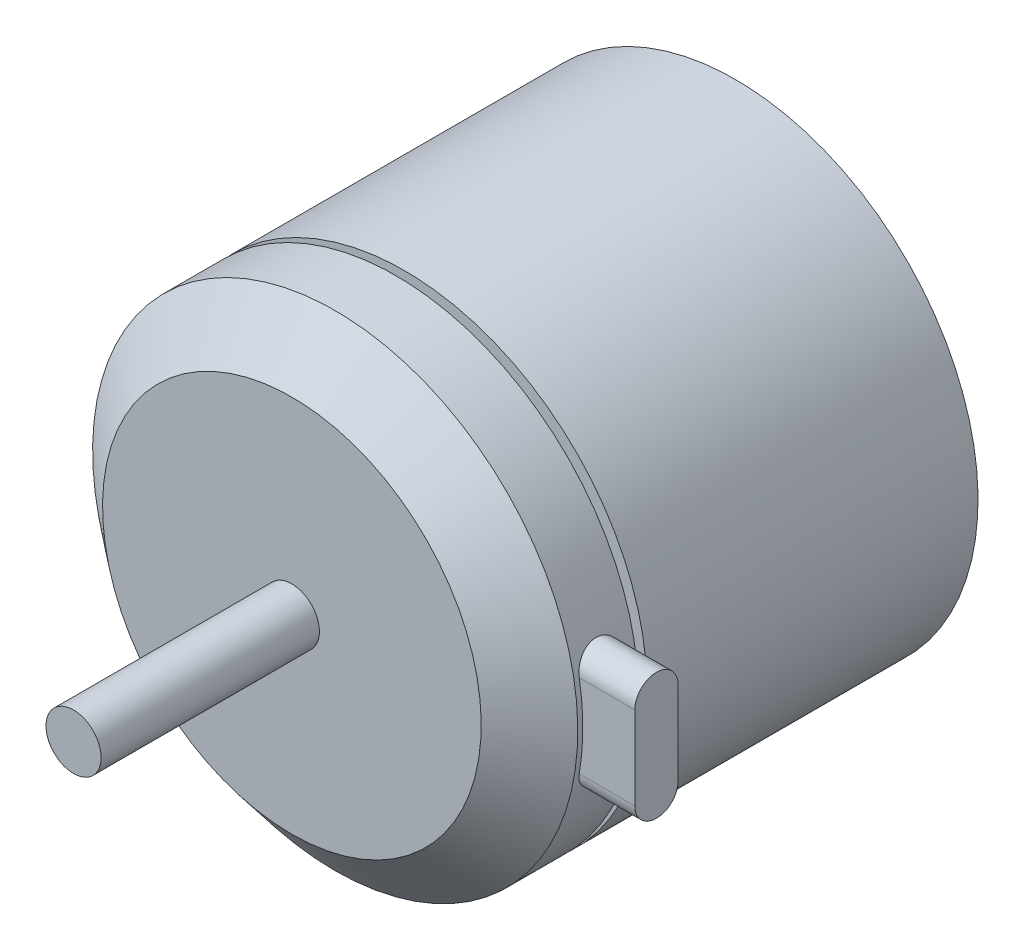
ISO-10303-21;
HEADER;
FILE_DESCRIPTION(('STEP AP214'),'2;1');
FILE_NAME('part.step','',(''),(''),'','','');
FILE_SCHEMA(('AUTOMOTIVE_DESIGN { 1 0 10303 214 1 1 1 1 }'));
ENDSEC;
DATA;
#1=APPLICATION_CONTEXT('core data for automotive mechanical design processes');
#2=APPLICATION_PROTOCOL_DEFINITION('international standard','automotive_design',2000,#1);
#3=PRODUCT_CONTEXT('',#1,'mechanical');
#4=PRODUCT('Part','Part','',(#3));
#5=PRODUCT_RELATED_PRODUCT_CATEGORY('part','',(#4));
#6=PRODUCT_DEFINITION_FORMATION('','',#4);
#7=PRODUCT_DEFINITION_CONTEXT('part definition',#1,'design');
#8=PRODUCT_DEFINITION('design','',#6,#7);
#9=PRODUCT_DEFINITION_SHAPE('','',#8);
#10=(LENGTH_UNIT() NAMED_UNIT(*) SI_UNIT(.MILLI.,.METRE.));
#11=(NAMED_UNIT(*) PLANE_ANGLE_UNIT() SI_UNIT($,.RADIAN.));
#12=(NAMED_UNIT(*) SI_UNIT($,.STERADIAN.) SOLID_ANGLE_UNIT());
#13=UNCERTAINTY_MEASURE_WITH_UNIT(LENGTH_MEASURE(1.E-05),#10,'distance_accuracy_value','');
#14=(GEOMETRIC_REPRESENTATION_CONTEXT(3) GLOBAL_UNCERTAINTY_ASSIGNED_CONTEXT((#13)) GLOBAL_UNIT_ASSIGNED_CONTEXT((#10,
#11,#12)) REPRESENTATION_CONTEXT('',''));
#15=CARTESIAN_POINT('',(0.,0.,0.));
#16=DIRECTION('',(0.,0.,1.));
#17=DIRECTION('',(1.,0.,0.));
#18=AXIS2_PLACEMENT_3D('',#15,#16,#17);
#19=CARTESIAN_POINT('',(0.,0.,22.55));
#20=DIRECTION('',(0.,0.,1.));
#21=DIRECTION('',(0.,-1.,0.));
#22=AXIS2_PLACEMENT_3D('',#19,#20,#21);
#23=CYLINDRICAL_SURFACE('',#22,14.);
#24=CARTESIAN_POINT('',(0.,0.,3.95));
#25=DIRECTION('',(0.,0.,1.));
#26=DIRECTION('',(0.,-1.,0.));
#27=AXIS2_PLACEMENT_3D('',#24,#25,#26);
#28=CIRCLE('',#27,14.);
#29=CARTESIAN_POINT('',(0.,-14.,3.94999999999999));
#30=VERTEX_POINT('',#29);
#31=EDGE_CURVE('E135',#30,#30,#28,.T.);
#32=ORIENTED_EDGE('',*,*,#31,.T.);
#33=EDGE_LOOP('',(#32));
#34=FACE_BOUND('',#33,.T.);
#35=CARTESIAN_POINT('',(0.,0.,7.45));
#36=DIRECTION('',(0.,0.,1.));
#37=DIRECTION('',(0.,-1.,0.));
#38=AXIS2_PLACEMENT_3D('',#35,#36,#37);
#39=CIRCLE('',#38,14.);
#40=CARTESIAN_POINT('',(0.,-14.,7.45));
#41=VERTEX_POINT('',#40);
#42=EDGE_CURVE('E138',#41,#41,#39,.T.);
#43=ORIENTED_EDGE('',*,*,#42,.F.);
#44=EDGE_LOOP('',(#43));
#45=FACE_BOUND('',#44,.T.);
#46=CARTESIAN_POINT('',(13.7927517196533,2.4,7.158936123469));
#47=CARTESIAN_POINT('',(13.8049579997668,2.32984665616621,7.15893331763109));
#48=CARTESIAN_POINT('',(13.8166324259604,2.25955630932709,7.15301248094008));
#49=CARTESIAN_POINT('',(13.8386240661835,2.12071632788645,7.12937370438224));
#50=CARTESIAN_POINT('',(13.8489399877856,2.05216840026345,7.11164462635648));
#51=CARTESIAN_POINT('',(13.8680421528803,1.91883915631029,7.06478046674951));
#52=CARTESIAN_POINT('',(13.8768281437007,1.85405846332323,7.03564350370241));
#53=CARTESIAN_POINT('',(13.8928114699814,1.73022887511694,6.96672930965807));
#54=CARTESIAN_POINT('',(13.9000091633989,1.67117869008724,6.92695448061423));
#55=CARTESIAN_POINT('',(13.9127992546305,1.56110967340118,6.83829566585727));
#56=CARTESIAN_POINT('',(13.9184063576336,1.51001938175588,6.78950250905021));
#57=CARTESIAN_POINT('',(13.9282128039744,1.41671963549054,6.68393407988574));
#58=CARTESIAN_POINT('',(13.9324121511597,1.37451015659821,6.62715882934503));
#59=CARTESIAN_POINT('',(13.9395178213522,1.30047014127505,6.50763842146956));
#60=CARTESIAN_POINT('',(13.9424322792844,1.26857465783872,6.44493396772794));
#61=CARTESIAN_POINT('',(13.947140052529,1.215727086,6.31503253479995));
#62=CARTESIAN_POINT('',(13.9489333815572,1.19477486371816,6.24783561058566));
#63=CARTESIAN_POINT('',(13.9514979514972,1.16444776726383,6.11096717327018));
#64=CARTESIAN_POINT('',(13.9522707417003,1.15505534550689,6.04129957642904));
#65=CARTESIAN_POINT('',(13.9528480124118,1.14806152655059,5.90137108955421));
#66=CARTESIAN_POINT('',(13.9526524952626,1.15046010082889,5.8311102009561));
#67=CARTESIAN_POINT('',(13.9512805529755,1.16697823484622,5.69199504842004));
#68=CARTESIAN_POINT('',(13.9501042002132,1.18109692976038,5.62314068107931));
#69=CARTESIAN_POINT('',(13.9466991601195,1.22064458044202,5.48878807228836));
#70=CARTESIAN_POINT('',(13.9444704760221,1.24607350144998,5.42328982052453));
#71=CARTESIAN_POINT('',(13.9388445618794,1.30750095354246,5.2975080120101));
#72=CARTESIAN_POINT('',(13.9354473387405,1.34349942215642,5.23722442444132));
#73=CARTESIAN_POINT('',(13.9273476195134,1.42501229353423,5.12357701065721));
#74=CARTESIAN_POINT('',(13.9226451345384,1.47052661527763,5.070213125532));
#75=CARTESIAN_POINT('',(13.9118048946484,1.56976803586401,4.97186716083128));
#76=CARTESIAN_POINT('',(13.9056662009507,1.62350049853327,4.92689059836281));
#77=CARTESIAN_POINT('',(13.8918723349883,1.73757839757932,4.8465976198772));
#78=CARTESIAN_POINT('',(13.8842171529659,1.79792387650583,4.81128126602125));
#79=CARTESIAN_POINT('',(13.8673469751399,1.92372743323077,4.75111671095438));
#80=CARTESIAN_POINT('',(13.8581257663015,1.98920529314878,4.72631163837194));
#81=CARTESIAN_POINT('',(13.8382342348309,2.12317147559064,4.68798529417694));
#82=CARTESIAN_POINT('',(13.827563839038,2.19165994998431,4.6744645924913));
#83=CARTESIAN_POINT('',(13.8048509667578,2.33046925278694,4.65889796872708));
#84=CARTESIAN_POINT('',(13.7927949606406,2.40080186834395,4.65697709544549));
#85=CARTESIAN_POINT('',(13.7677250583069,2.54062872265417,4.6648988798193));
#86=CARTESIAN_POINT('',(13.754711071031,2.61012288097656,4.67474265710297));
#87=CARTESIAN_POINT('',(13.727945230602,2.74745155052186,4.70610026900479));
#88=CARTESIAN_POINT('',(13.714185085079,2.81524384522036,4.72779201610896));
#89=CARTESIAN_POINT('',(13.6866542717042,2.94617981088443,4.78234009085539));
#90=CARTESIAN_POINT('',(13.6728836030469,3.00932308018145,4.81519738180933));
#91=CARTESIAN_POINT('',(13.6458219148097,3.1297590338086,4.89154732684884));
#92=CARTESIAN_POINT('',(13.632536261689,3.18699458084946,4.93513212742348));
#93=CARTESIAN_POINT('',(13.6072452493954,3.29330658730026,5.03163558860133));
#94=CARTESIAN_POINT('',(13.5952398491969,3.34238330818767,5.08455394996662));
#95=CARTESIAN_POINT('',(13.5733010570957,3.43038459965917,5.1976792090709));
#96=CARTESIAN_POINT('',(13.5633464562243,3.46941425094324,5.25780013922571));
#97=CARTESIAN_POINT('',(13.545947234434,3.53673987236768,5.38411123029044));
#98=CARTESIAN_POINT('',(13.5385021267771,3.56503792412844,5.45030021107763));
#99=CARTESIAN_POINT('',(13.5267808972628,3.609253335922,5.5847914728706));
#100=CARTESIAN_POINT('',(13.5224182309546,3.62550948903847,5.65297482576328));
#101=CARTESIAN_POINT('',(13.5167986004113,3.64640588195747,5.79122055623561));
#102=CARTESIAN_POINT('',(13.5155410881962,3.65104817131104,5.86128260006813));
#103=CARTESIAN_POINT('',(13.5162057809975,3.64858615532328,5.99938401400765));
#104=CARTESIAN_POINT('',(13.5180475063612,3.64177916214475,6.06742929733792));
#105=CARTESIAN_POINT('',(13.5246400887842,3.61721854017901,6.20136456138442));
#106=CARTESIAN_POINT('',(13.5293909015197,3.59946507817551,6.26725457492289));
#107=CARTESIAN_POINT('',(13.5415117042244,3.55359245740492,6.39508213864496));
#108=CARTESIAN_POINT('',(13.5488826033451,3.52546970043934,6.45701830806182));
#109=CARTESIAN_POINT('',(13.5658161973798,3.45973673542355,6.57529736403061));
#110=CARTESIAN_POINT('',(13.5753790739826,3.42212574088566,6.63163978637253));
#111=CARTESIAN_POINT('',(13.5964477728098,3.33744722866814,6.7386746199472));
#112=CARTESIAN_POINT('',(13.6079964872183,3.29016527678918,6.78918885514883));
#113=CARTESIAN_POINT('',(13.6322713934435,3.18809110795582,6.88164197425808));
#114=CARTESIAN_POINT('',(13.6449980316831,3.13329603977618,6.92357758745295));
#115=CARTESIAN_POINT('',(13.671421455375,3.01595019894538,6.99894161312979));
#116=CARTESIAN_POINT('',(13.6851358260878,2.95321745956015,7.03208047706131));
#117=CARTESIAN_POINT('',(13.7125666408842,2.82310486198821,7.08726841270419));
#118=CARTESIAN_POINT('',(13.726283069543,2.75572965458562,7.10932840461017));
#119=CARTESIAN_POINT('',(13.7489070327131,2.64004775596412,7.13661900694201));
#120=CARTESIAN_POINT('',(13.7579581775469,2.5924817640583,7.1449695305436));
#121=CARTESIAN_POINT('',(13.7756743285492,2.4966322078754,7.15612906758287));
#122=CARTESIAN_POINT('',(13.7843393330586,2.44834864051608,7.15893805721073));
#123=CARTESIAN_POINT('',(13.7927517196533,2.4,7.158936123469));
#124=B_SPLINE_CURVE_WITH_KNOTS('',3,(#46,#47,#48,#49,#50,#51,#52,#53,#54,#55,#56,#57,#58,#59,
#60,#61,#62,#63,#64,#65,#66,#67,#68,#69,#70,#71,#72,#73,#74,#75,#76,#77,#78,#79,#80,#81,#82,#83,
#84,#85,#86,#87,#88,#89,#90,#91,#92,#93,#94,#95,#96,#97,#98,#99,#100,#101,#102,#103,#104,#105,
#106,#107,#108,#109,#110,#111,#112,#113,#114,#115,#116,#117,#118,#119,#120,#121,#122,#123),
.UNSPECIFIED.,.T.,.F.,(4,2,2,2,2,2,2,2,2,2,2,2,2,2,2,2,2,2,2,2,2,2,2,2,2,2,2,2,2,2,2,2,2,2,2,2,
2,2,4),(0.,0.213447038063583,0.427095696356338,0.640779605889871,0.854415307811519,
1.06600626709658,1.27759664807154,1.48782745901992,1.69805569795167,1.90796441874818,
2.11787263177708,2.32776535710653,2.53765743738091,2.74754827712808,2.95743732988306,
3.1674639625304,3.3774919466184,3.58837353848394,3.79926578046223,4.01242748777733,
4.22560948306245,4.44208438681954,4.6585779717774,4.87700038277209,5.09541579232411,
5.31144438710935,5.52743105712692,5.73708262127014,5.94669718464325,6.15095214074658,
6.35520398483652,6.55952677216893,6.76386650155061,6.97335597864233,7.18292517810857,
7.39871655726878,7.61429481620556,7.76139870617576,7.90850322819268),.UNSPECIFIED.);
#125=CARTESIAN_POINT('',(13.7927517196533,2.4,4.65893612346899));
#126=VERTEX_POINT('',#125);
#127=CARTESIAN_POINT('',(13.7927517196533,2.4,7.158936123469));
#128=VERTEX_POINT('',#127);
#129=EDGE_CURVE('E11',#126,#128,#124,.T.);
#130=ORIENTED_EDGE('',*,*,#129,.F.);
#131=CARTESIAN_POINT('',(0.,0.,4.65893612346899));
#132=DIRECTION('',(0.,0.,1.));
#133=DIRECTION('',(1.,0.,0.));
#134=AXIS2_PLACEMENT_3D('',#131,#132,#133);
#135=CIRCLE('',#134,14.);
#136=CARTESIAN_POINT('',(13.7927517196533,-2.4,4.65893612346899));
#137=VERTEX_POINT('',#136);
#138=EDGE_CURVE('E150',#137,#126,#135,.T.);
#139=ORIENTED_EDGE('',*,*,#138,.F.);
#140=CARTESIAN_POINT('',(13.7927517196533,-2.4,7.158936123469));
#141=CARTESIAN_POINT('',(13.780302245697,-2.47154209616521,7.15893301567698));
#142=CARTESIAN_POINT('',(13.7672826808585,-2.54303865255947,7.1527744818256));
#143=CARTESIAN_POINT('',(13.7405245667623,-2.6838667866475,7.12837845788841));
#144=CARTESIAN_POINT('',(13.726785097875,-2.75319540517082,7.11012515312788));
#145=CARTESIAN_POINT('',(13.6991304142212,-2.88765190047125,7.06209961931391));
#146=CARTESIAN_POINT('',(13.6852153331505,-2.95278276660084,7.03233569548358));
#147=CARTESIAN_POINT('',(13.6578067896785,-3.07707139314781,6.96210696053179));
#148=CARTESIAN_POINT('',(13.6443132253609,-3.13623060526087,6.92164475883623));
#149=CARTESIAN_POINT('',(13.6183736541685,-3.24702124145471,6.83099197119919));
#150=CARTESIAN_POINT('',(13.6059296340319,-3.29863851847746,6.78078350375276));
#151=CARTESIAN_POINT('',(13.5827910679217,-3.39265930749941,6.67201765099814));
#152=CARTESIAN_POINT('',(13.5720964340006,-3.435063282716,6.61346068567283));
#153=CARTESIAN_POINT('',(13.5532742655377,-3.50858595265678,6.49079011954205));
#154=CARTESIAN_POINT('',(13.5451022811969,-3.53990168123884,6.42680156607071));
#155=CARTESIAN_POINT('',(13.5315717904969,-3.59127783017089,6.2941775886012));
#156=CARTESIAN_POINT('',(13.5262126747884,-3.61134068828531,6.22554317467189));
#157=CARTESIAN_POINT('',(13.5187825785333,-3.63905460169251,6.08787705157679));
#158=CARTESIAN_POINT('',(13.5166142781018,-3.64707317441428,6.01892446530962));
#159=CARTESIAN_POINT('',(13.5153941688966,-3.65159241173047,5.88061961885425));
#160=CARTESIAN_POINT('',(13.5163419560026,-3.64809456987015,5.81126741165669));
#161=CARTESIAN_POINT('',(13.5212456663304,-3.62987600656706,5.67545028560377));
#162=CARTESIAN_POINT('',(13.5251468840969,-3.61535937002564,5.60895583380432));
#163=CARTESIAN_POINT('',(13.5356507868651,-3.57583172878925,5.47939250742093));
#164=CARTESIAN_POINT('',(13.5422535781888,-3.55082031106575,5.41632376776834));
#165=CARTESIAN_POINT('',(13.5578556410704,-3.49077612084009,5.29464019254107));
#166=CARTESIAN_POINT('',(13.5668795117533,-3.45564019167374,5.23607949653165));
#167=CARTESIAN_POINT('',(13.5867893018054,-3.3765095406749,5.12564458972975));
#168=CARTESIAN_POINT('',(13.5976754918659,-3.33251353084899,5.07377135289615));
#169=CARTESIAN_POINT('',(13.6210973394499,-3.23546997486559,4.97654939980571));
#170=CARTESIAN_POINT('',(13.6336722246003,-3.18219342638062,4.93143869997719));
#171=CARTESIAN_POINT('',(13.6595939017979,-3.06901638881599,4.8507542812717));
#172=CARTESIAN_POINT('',(13.6729408067351,-3.00911492982298,4.8151819614692));
#173=CARTESIAN_POINT('',(13.7001561363566,-2.8827070303358,4.7537065645167));
#174=CARTESIAN_POINT('',(13.7140292467464,-2.81607264645384,4.72806826811898));
#175=CARTESIAN_POINT('',(13.7413967192547,-2.67934226286505,4.68847141044191));
#176=CARTESIAN_POINT('',(13.7548910651722,-2.60924611543985,4.67451334803159));
#177=CARTESIAN_POINT('',(13.7810804450312,-2.46719684051281,4.65869002741169));
#178=CARTESIAN_POINT('',(13.7937713324896,-2.39523641595485,4.65688312145948));
#179=CARTESIAN_POINT('',(13.8179013748371,-2.25186271183907,4.66566924148799));
#180=CARTESIAN_POINT('',(13.8293406088351,-2.18044939796754,4.676261483303));
#181=CARTESIAN_POINT('',(13.8505819682313,-2.04114825949574,4.70944064309263));
#182=CARTESIAN_POINT('',(13.8604023047933,-1.97322813058399,4.73188018111875));
#183=CARTESIAN_POINT('',(13.8784477823725,-1.84203016248182,4.78810526033142));
#184=CARTESIAN_POINT('',(13.8866730555817,-1.77875193886112,4.82188986065452));
#185=CARTESIAN_POINT('',(13.9014048744831,-1.65966711081869,4.89929489432244));
#186=CARTESIAN_POINT('',(13.9079352593929,-1.60376301441595,4.94276085907035));
#187=CARTESIAN_POINT('',(13.9195081674379,-1.50000764888545,5.03859129884301));
#188=CARTESIAN_POINT('',(13.9245507617662,-1.45215599448225,5.09095534789083));
#189=CARTESIAN_POINT('',(13.9332351684537,-1.3663122236943,5.20260323207841));
#190=CARTESIAN_POINT('',(13.9368886116593,-1.32823914961486,5.26182393960824));
#191=CARTESIAN_POINT('',(13.9429941256065,-1.26254037831848,5.38585819208774));
#192=CARTESIAN_POINT('',(13.9454462164976,-1.23491450587946,5.45067164321267));
#193=CARTESIAN_POINT('',(13.9492675012683,-1.19097637974834,5.58387056833819));
#194=CARTESIAN_POINT('',(13.9506394605739,-1.17463524738122,5.65224643934765));
#195=CARTESIAN_POINT('',(13.9523926086753,-1.15362619623794,5.79078116123604));
#196=CARTESIAN_POINT('',(13.95277379814,-1.1489582695817,5.86094001091133));
#197=CARTESIAN_POINT('',(13.9525699680932,-1.15143067328628,6.0010294397966));
#198=CARTESIAN_POINT('',(13.9519852013667,-1.15856791430529,6.07096007393092));
#199=CARTESIAN_POINT('',(13.9498126477348,-1.18443801701204,6.2086265289224));
#200=CARTESIAN_POINT('',(13.9482248610549,-1.20317087609317,6.27636235027292));
#201=CARTESIAN_POINT('',(13.9439544304957,-1.25168846160427,6.40771730486194));
#202=CARTESIAN_POINT('',(13.9412717706705,-1.28147334899638,6.47133637812811));
#203=CARTESIAN_POINT('',(13.9346838570077,-1.35122447886092,6.59265034775883));
#204=CARTESIAN_POINT('',(13.9307786579457,-1.39119026516557,6.6503455093891));
#205=CARTESIAN_POINT('',(13.9216083695625,-1.48013989139226,6.75819723617975));
#206=CARTESIAN_POINT('',(13.9163430416874,-1.52912531284093,6.80835247646457));
#207=CARTESIAN_POINT('',(13.9043382137524,-1.63468480804595,6.89972681719321));
#208=CARTESIAN_POINT('',(13.8975983732209,-1.69126063329257,6.94094384937962));
#209=CARTESIAN_POINT('',(13.8825669438221,-1.81051248569673,7.0134224941345));
#210=CARTESIAN_POINT('',(13.8742706249132,-1.87320682035189,7.04465295434698));
#211=CARTESIAN_POINT('',(13.8561724685423,-2.00268351311028,7.09615307113996));
#212=CARTESIAN_POINT('',(13.8463722778256,-2.06946135222358,7.11643460838672));
#213=CARTESIAN_POINT('',(13.8292165764134,-2.1805257016275,7.14031338271769));
#214=CARTESIAN_POINT('',(13.8222649585753,-2.2241775913571,7.147294522051));
#215=CARTESIAN_POINT('',(13.8078648272492,-2.31189207505754,7.15660684358593));
#216=CARTESIAN_POINT('',(13.8004163149382,-2.35595466805545,7.15893803680028));
#217=CARTESIAN_POINT('',(13.7927517196533,-2.4,7.158936123469));
#218=B_SPLINE_CURVE_WITH_KNOTS('',3,(#140,#141,#142,#143,#144,#145,#146,#147,#148,#149,#150,
#151,#152,#153,#154,#155,#156,#157,#158,#159,#160,#161,#162,#163,#164,#165,#166,#167,#168,#169,
#170,#171,#172,#173,#174,#175,#176,#177,#178,#179,#180,#181,#182,#183,#184,#185,#186,#187,#188,
#189,#190,#191,#192,#193,#194,#195,#196,#197,#198,#199,#200,#201,#202,#203,#204,#205,#206,#207,
#208,#209,#210,#211,#212,#213,#214,#215,#216,#217),.UNSPECIFIED.,.T.,.F.,(4,2,2,2,2,2,2,2,2,2,2,
2,2,2,2,2,2,2,2,2,2,2,2,2,2,2,2,2,2,2,2,2,2,2,2,2,2,2,4),(0.,0.217687079812036,
0.435659362375117,0.653474664584217,0.871236888212687,1.08940248293038,1.30755710639217,
1.52161362280849,1.73562374918498,1.94296061076712,2.15027058422451,2.35383181173692,
2.55740105127726,2.76312256115002,2.96887399845539,3.1807036958811,3.39256444717605,
3.60973683352325,3.82691849494545,4.0451423655147,4.26335243558469,4.47890981105397,
4.69444931443168,4.9067690470187,5.11907861811047,5.32956926188728,5.54005637512591,
5.7500028164451,5.95994911603861,6.16984048263308,6.37973180204584,6.58962617844353,
6.79951115191751,7.00943296228294,7.219403295814,7.4300223670356,7.64041243396287,
7.77443314222324,7.90845353307425),.UNSPECIFIED.);
#219=CARTESIAN_POINT('',(13.7927517196533,-2.4,7.158936123469));
#220=VERTEX_POINT('',#219);
#221=EDGE_CURVE('E57',#220,#137,#218,.T.);
#222=ORIENTED_EDGE('',*,*,#221,.F.);
#223=CARTESIAN_POINT('',(0.,0.,7.158936123469));
#224=DIRECTION('',(0.,0.,-1.));
#225=DIRECTION('',(-1.,0.,0.));
#226=AXIS2_PLACEMENT_3D('',#223,#224,#225);
#227=CIRCLE('',#226,14.);
#228=EDGE_CURVE('E47',#128,#220,#227,.T.);
#229=ORIENTED_EDGE('',*,*,#228,.F.);
#230=EDGE_LOOP('',(#130,#139,#222,#229));
#231=FACE_BOUND('',#230,.T.);
#232=ADVANCED_FACE('F34',(#34,#45,#231),#23,.T.);
#233=CARTESIAN_POINT('',(0.,0.,22.55));
#234=DIRECTION('',(0.,0.,-1.));
#235=DIRECTION('',(0.,1.,0.));
#236=AXIS2_PLACEMENT_3D('',#233,#234,#235);
#237=PLANE('',#236);
#238=CARTESIAN_POINT('',(0.,0.,22.55));
#239=DIRECTION('',(0.,0.,1.));
#240=DIRECTION('',(0.,-1.,0.));
#241=AXIS2_PLACEMENT_3D('',#238,#239,#240);
#242=CIRCLE('',#241,1.59);
#243=CARTESIAN_POINT('',(0.,-1.59,22.55));
#244=VERTEX_POINT('',#243);
#245=EDGE_CURVE('E147',#244,#244,#242,.T.);
#246=ORIENTED_EDGE('',*,*,#245,.T.);
#247=EDGE_LOOP('',(#246));
#248=FACE_BOUND('',#247,.T.);
#249=ADVANCED_FACE('F36',(#248),#237,.F.);
#250=CARTESIAN_POINT('',(0.,0.,22.55));
#251=DIRECTION('',(0.,0.,1.));
#252=DIRECTION('',(0.,-1.,0.));
#253=AXIS2_PLACEMENT_3D('',#250,#251,#252);
#254=CYLINDRICAL_SURFACE('',#253,1.59);
#255=ORIENTED_EDGE('',*,*,#245,.F.);
#256=EDGE_LOOP('',(#255));
#257=FACE_BOUND('',#256,.T.);
#258=CARTESIAN_POINT('',(0.,0.,9.95));
#259=DIRECTION('',(0.,0.,1.));
#260=DIRECTION('',(0.,-1.,0.));
#261=AXIS2_PLACEMENT_3D('',#258,#259,#260);
#262=CIRCLE('',#261,1.59);
#263=CARTESIAN_POINT('',(0.,-1.59,9.95));
#264=VERTEX_POINT('',#263);
#265=EDGE_CURVE('E144',#264,#264,#262,.T.);
#266=ORIENTED_EDGE('',*,*,#265,.T.);
#267=EDGE_LOOP('',(#266));
#268=FACE_BOUND('',#267,.T.);
#269=ADVANCED_FACE('F232',(#257,#268),#254,.T.);
#270=CARTESIAN_POINT('',(0.,1.59,9.95));
#271=DIRECTION('',(0.,0.,-1.));
#272=DIRECTION('',(0.,1.,0.));
#273=AXIS2_PLACEMENT_3D('',#270,#271,#272);
#274=PLANE('',#273);
#275=ORIENTED_EDGE('',*,*,#265,.F.);
#276=EDGE_LOOP('',(#275));
#277=FACE_BOUND('',#276,.T.);
#278=CARTESIAN_POINT('',(0.,0.,9.95));
#279=DIRECTION('',(0.,0.,1.));
#280=DIRECTION('',(0.,-1.,0.));
#281=AXIS2_PLACEMENT_3D('',#278,#279,#280);
#282=CIRCLE('',#281,10.9269779962423);
#283=CARTESIAN_POINT('',(0.,-10.9269779962423,9.95));
#284=VERTEX_POINT('',#283);
#285=EDGE_CURVE('E141',#284,#284,#282,.T.);
#286=ORIENTED_EDGE('',*,*,#285,.T.);
#287=EDGE_LOOP('',(#286));
#288=FACE_BOUND('',#287,.T.);
#289=ADVANCED_FACE('F222',(#277,#288),#274,.F.);
#290=CARTESIAN_POINT('',(0.,0.,7.45));
#291=DIRECTION('',(0.,0.,-1.));
#292=DIRECTION('',(0.,1.,0.));
#293=AXIS2_PLACEMENT_3D('',#290,#291,#292);
#294=CONICAL_SURFACE('',#293,14.,0.887858797658367);
#295=ORIENTED_EDGE('',*,*,#285,.F.);
#296=EDGE_LOOP('',(#295));
#297=FACE_BOUND('',#296,.T.);
#298=ORIENTED_EDGE('',*,*,#42,.T.);
#299=EDGE_LOOP('',(#298));
#300=FACE_BOUND('',#299,.T.);
#301=ADVANCED_FACE('F217',(#297,#300),#294,.T.);
#302=CARTESIAN_POINT('',(0.,14.,3.95));
#303=DIRECTION('',(0.,0.,1.));
#304=DIRECTION('',(0.,-1.,0.));
#305=AXIS2_PLACEMENT_3D('',#302,#303,#304);
#306=PLANE('',#305);
#307=ORIENTED_EDGE('',*,*,#31,.F.);
#308=EDGE_LOOP('',(#307));
#309=FACE_BOUND('',#308,.T.);
#310=CARTESIAN_POINT('',(0.,0.,3.95));
#311=DIRECTION('',(0.,0.,1.));
#312=DIRECTION('',(0.,-1.,0.));
#313=AXIS2_PLACEMENT_3D('',#310,#311,#312);
#314=CIRCLE('',#313,1.59);
#315=CARTESIAN_POINT('',(0.,-1.58999999999999,3.95));
#316=VERTEX_POINT('',#315);
#317=EDGE_CURVE('E132',#316,#316,#314,.T.);
#318=ORIENTED_EDGE('',*,*,#317,.T.);
#319=EDGE_LOOP('',(#318));
#320=FACE_BOUND('',#319,.T.);
#321=ADVANCED_FACE('F214',(#309,#320),#306,.F.);
#322=CARTESIAN_POINT('',(0.,0.,22.55));
#323=DIRECTION('',(0.,0.,1.));
#324=DIRECTION('',(0.,-1.,0.));
#325=AXIS2_PLACEMENT_3D('',#322,#323,#324);
#326=CYLINDRICAL_SURFACE('',#325,1.59);
#327=ORIENTED_EDGE('',*,*,#317,.F.);
#328=EDGE_LOOP('',(#327));
#329=FACE_BOUND('',#328,.T.);
#330=CARTESIAN_POINT('',(0.,0.,3.45));
#331=DIRECTION('',(0.,0.,1.));
#332=DIRECTION('',(0.,-1.,0.));
#333=AXIS2_PLACEMENT_3D('',#330,#331,#332);
#334=CIRCLE('',#333,1.59);
#335=CARTESIAN_POINT('',(0.,-1.58999999999999,3.45));
#336=VERTEX_POINT('',#335);
#337=EDGE_CURVE('E129',#336,#336,#334,.T.);
#338=ORIENTED_EDGE('',*,*,#337,.T.);
#339=EDGE_LOOP('',(#338));
#340=FACE_BOUND('',#339,.T.);
#341=ADVANCED_FACE('F211',(#329,#340),#326,.T.);
#342=CARTESIAN_POINT('',(0.,1.59,3.45));
#343=DIRECTION('',(0.,0.,-1.));
#344=DIRECTION('',(0.,1.,0.));
#345=AXIS2_PLACEMENT_3D('',#342,#343,#344);
#346=PLANE('',#345);
#347=ORIENTED_EDGE('',*,*,#337,.F.);
#348=EDGE_LOOP('',(#347));
#349=FACE_BOUND('',#348,.T.);
#350=CARTESIAN_POINT('',(0.,0.,3.44999999999999));
#351=DIRECTION('',(0.,0.,1.));
#352=DIRECTION('',(0.,-1.,0.));
#353=AXIS2_PLACEMENT_3D('',#350,#351,#352);
#354=CIRCLE('',#353,14.);
#355=CARTESIAN_POINT('',(0.,-14.,3.44999999999999));
#356=VERTEX_POINT('',#355);
#357=EDGE_CURVE('E126',#356,#356,#354,.T.);
#358=ORIENTED_EDGE('',*,*,#357,.T.);
#359=EDGE_LOOP('',(#358));
#360=FACE_BOUND('',#359,.T.);
#361=ADVANCED_FACE('F207',(#349,#360),#346,.F.);
#362=CARTESIAN_POINT('',(0.,0.,22.55));
#363=DIRECTION('',(0.,0.,1.));
#364=DIRECTION('',(0.,-1.,0.));
#365=AXIS2_PLACEMENT_3D('',#362,#363,#364);
#366=CYLINDRICAL_SURFACE('',#365,14.);
#367=ORIENTED_EDGE('',*,*,#357,.F.);
#368=EDGE_LOOP('',(#367));
#369=FACE_BOUND('',#368,.T.);
#370=CARTESIAN_POINT('',(0.,0.,-15.65));
#371=DIRECTION('',(0.,0.,1.));
#372=DIRECTION('',(0.,-1.,0.));
#373=AXIS2_PLACEMENT_3D('',#370,#371,#372);
#374=CIRCLE('',#373,14.);
#375=CARTESIAN_POINT('',(0.,-14.,-15.65));
#376=VERTEX_POINT('',#375);
#377=EDGE_CURVE('E123',#376,#376,#374,.T.);
#378=ORIENTED_EDGE('',*,*,#377,.T.);
#379=EDGE_LOOP('',(#378));
#380=FACE_BOUND('',#379,.T.);
#381=ADVANCED_FACE('F203',(#369,#380),#366,.T.);
#382=CARTESIAN_POINT('',(0.,0.,-21.05));
#383=DIRECTION('',(0.,0.,1.));
#384=DIRECTION('',(0.,-1.,0.));
#385=AXIS2_PLACEMENT_3D('',#382,#383,#384);
#386=CONICAL_SURFACE('',#385,6.1878417056568,0.965980392845217);
#387=ORIENTED_EDGE('',*,*,#377,.F.);
#388=EDGE_LOOP('',(#387));
#389=FACE_BOUND('',#388,.T.);
#390=CARTESIAN_POINT('',(0.,0.,-21.05));
#391=DIRECTION('',(0.,0.,1.));
#392=DIRECTION('',(0.,-1.,0.));
#393=AXIS2_PLACEMENT_3D('',#390,#391,#392);
#394=CIRCLE('',#393,6.1878417056568);
#395=CARTESIAN_POINT('',(0.,-6.18784170565679,-21.05));
#396=VERTEX_POINT('',#395);
#397=EDGE_CURVE('E120',#396,#396,#394,.T.);
#398=ORIENTED_EDGE('',*,*,#397,.T.);
#399=EDGE_LOOP('',(#398));
#400=FACE_BOUND('',#399,.T.);
#401=ADVANCED_FACE('F199',(#389,#400),#386,.T.);
#402=CARTESIAN_POINT('',(0.,6.18784170565681,-21.05));
#403=DIRECTION('',(0.,0.,1.));
#404=DIRECTION('',(0.,-1.,0.));
#405=AXIS2_PLACEMENT_3D('',#402,#403,#404);
#406=PLANE('',#405);
#407=ORIENTED_EDGE('',*,*,#397,.F.);
#408=EDGE_LOOP('',(#407));
#409=FACE_BOUND('',#408,.T.);
#410=CARTESIAN_POINT('',(0.,0.,-21.05));
#411=DIRECTION('',(0.,0.,1.));
#412=DIRECTION('',(0.,-1.,0.));
#413=AXIS2_PLACEMENT_3D('',#410,#411,#412);
#414=CIRCLE('',#413,3.99999999999999);
#415=CARTESIAN_POINT('',(0.,-3.99999999999998,-21.05));
#416=VERTEX_POINT('',#415);
#417=EDGE_CURVE('E117',#416,#416,#414,.T.);
#418=ORIENTED_EDGE('',*,*,#417,.T.);
#419=EDGE_LOOP('',(#418));
#420=FACE_BOUND('',#419,.T.);
#421=ADVANCED_FACE('F195',(#409,#420),#406,.F.);
#422=CARTESIAN_POINT('',(0.,0.,22.55));
#423=DIRECTION('',(0.,0.,1.));
#424=DIRECTION('',(0.,-1.,0.));
#425=AXIS2_PLACEMENT_3D('',#422,#423,#424);
#426=CYLINDRICAL_SURFACE('',#425,3.99999999999999);
#427=ORIENTED_EDGE('',*,*,#417,.F.);
#428=EDGE_LOOP('',(#427));
#429=FACE_BOUND('',#428,.T.);
#430=CARTESIAN_POINT('',(0.,0.,-21.6527033631489));
#431=DIRECTION('',(0.,0.,1.));
#432=DIRECTION('',(0.,-1.,0.));
#433=AXIS2_PLACEMENT_3D('',#430,#431,#432);
#434=CIRCLE('',#433,3.99999999999999);
#435=CARTESIAN_POINT('',(0.,-3.99999999999998,-21.6527033631489));
#436=VERTEX_POINT('',#435);
#437=EDGE_CURVE('E114',#436,#436,#434,.T.);
#438=ORIENTED_EDGE('',*,*,#437,.T.);
#439=EDGE_LOOP('',(#438));
#440=FACE_BOUND('',#439,.T.);
#441=ADVANCED_FACE('F191',(#429,#440),#426,.T.);
#442=CARTESIAN_POINT('',(0.,0.,-22.55));
#443=DIRECTION('',(0.,0.,1.));
#444=DIRECTION('',(0.,-1.,0.));
#445=AXIS2_PLACEMENT_3D('',#442,#443,#444);
#446=CONICAL_SURFACE('',#445,2.58901823135328,1.0043702655222);
#447=ORIENTED_EDGE('',*,*,#437,.F.);
#448=EDGE_LOOP('',(#447));
#449=FACE_BOUND('',#448,.T.);
#450=CARTESIAN_POINT('',(0.,0.,-22.55));
#451=DIRECTION('',(0.,0.,1.));
#452=DIRECTION('',(0.,-1.,0.));
#453=AXIS2_PLACEMENT_3D('',#450,#451,#452);
#454=CIRCLE('',#453,2.58901823135328);
#455=CARTESIAN_POINT('',(0.,-2.58901823135327,-22.55));
#456=VERTEX_POINT('',#455);
#457=EDGE_CURVE('E111',#456,#456,#454,.T.);
#458=ORIENTED_EDGE('',*,*,#457,.T.);
#459=EDGE_LOOP('',(#458));
#460=FACE_BOUND('',#459,.T.);
#461=ADVANCED_FACE('F187',(#449,#460),#446,.T.);
#462=CARTESIAN_POINT('',(0.,2.58901823135329,-22.55));
#463=DIRECTION('',(0.,0.,1.));
#464=DIRECTION('',(0.,-1.,0.));
#465=AXIS2_PLACEMENT_3D('',#462,#463,#464);
#466=PLANE('',#465);
#467=ORIENTED_EDGE('',*,*,#457,.F.);
#468=EDGE_LOOP('',(#467));
#469=FACE_BOUND('',#468,.T.);
#470=CARTESIAN_POINT('',(0.,0.,-22.55));
#471=DIRECTION('',(0.,0.,1.));
#472=DIRECTION('',(0.,-1.,0.));
#473=AXIS2_PLACEMENT_3D('',#470,#471,#472);
#474=CIRCLE('',#473,1.66009894583257);
#475=CARTESIAN_POINT('',(0.,-1.66009894583256,-22.55));
#476=VERTEX_POINT('',#475);
#477=EDGE_CURVE('E108',#476,#476,#474,.T.);
#478=ORIENTED_EDGE('',*,*,#477,.T.);
#479=EDGE_LOOP('',(#478));
#480=FACE_BOUND('',#479,.T.);
#481=ADVANCED_FACE('F183',(#469,#480),#466,.F.);
#482=CARTESIAN_POINT('',(0.,0.,-22.4799010541674));
#483=DIRECTION('',(0.,0.,-1.));
#484=DIRECTION('',(0.,1.,0.));
#485=AXIS2_PLACEMENT_3D('',#482,#483,#484);
#486=CONICAL_SURFACE('',#485,1.58999999999999,0.785398163397451);
#487=ORIENTED_EDGE('',*,*,#477,.F.);
#488=EDGE_LOOP('',(#487));
#489=FACE_BOUND('',#488,.T.);
#490=CARTESIAN_POINT('',(0.,0.,-22.4799010541674));
#491=DIRECTION('',(0.,0.,1.));
#492=DIRECTION('',(0.,-1.,0.));
#493=AXIS2_PLACEMENT_3D('',#490,#491,#492);
#494=CIRCLE('',#493,1.58999999999999);
#495=CARTESIAN_POINT('',(0.,-1.58999999999998,-22.4799010541674));
#496=VERTEX_POINT('',#495);
#497=EDGE_CURVE('E100',#496,#496,#494,.T.);
#498=ORIENTED_EDGE('',*,*,#497,.T.);
#499=EDGE_LOOP('',(#498));
#500=FACE_BOUND('',#499,.T.);
#501=ADVANCED_FACE('F179',(#489,#500),#486,.F.);
#502=CARTESIAN_POINT('',(0.,0.,-22.55));
#503=DIRECTION('',(0.,0.,1.));
#504=DIRECTION('',(0.,-1.,0.));
#505=AXIS2_PLACEMENT_3D('',#502,#503,#504);
#506=CONICAL_SURFACE('',#505,1.51990105416742,0.785398163397448);
#507=ORIENTED_EDGE('',*,*,#497,.F.);
#508=EDGE_LOOP('',(#507));
#509=FACE_BOUND('',#508,.T.);
#510=CARTESIAN_POINT('',(0.,0.,-22.55));
#511=DIRECTION('',(0.,0.,1.));
#512=DIRECTION('',(0.,-1.,0.));
#513=AXIS2_PLACEMENT_3D('',#510,#511,#512);
#514=CIRCLE('',#513,1.51990105416742);
#515=CARTESIAN_POINT('',(0.,-1.51990105416741,-22.55));
#516=VERTEX_POINT('',#515);
#517=EDGE_CURVE('E97',#516,#516,#514,.T.);
#518=ORIENTED_EDGE('',*,*,#517,.T.);
#519=EDGE_LOOP('',(#518));
#520=FACE_BOUND('',#519,.T.);
#521=ADVANCED_FACE('F175',(#509,#520),#506,.T.);
#522=CARTESIAN_POINT('',(0.,1.51990105416742,-22.55));
#523=DIRECTION('',(0.,0.,1.));
#524=DIRECTION('',(0.,-1.,0.));
#525=AXIS2_PLACEMENT_3D('',#522,#523,#524);
#526=PLANE('',#525);
#527=ORIENTED_EDGE('',*,*,#517,.F.);
#528=EDGE_LOOP('',(#527));
#529=FACE_BOUND('',#528,.T.);
#530=ADVANCED_FACE('F172',(#529),#526,.F.);
#531=CARTESIAN_POINT('',(17.,2.4,5.90893612346899));
#532=DIRECTION('',(-1.,0.,0.));
#533=DIRECTION('',(0.,0.,1.));
#534=AXIS2_PLACEMENT_3D('',#531,#532,#533);
#535=CYLINDRICAL_SURFACE('',#534,1.25);
#536=DIRECTION('',(-1.,0.,0.));
#537=VECTOR('',#536,1.);
#538=CARTESIAN_POINT('',(17.,2.4,4.65893612346899));
#539=LINE('',#538,#537);
#540=CARTESIAN_POINT('',(17.,2.4,4.65893612346899));
#541=VERTEX_POINT('',#540);
#542=EDGE_CURVE('E238',#541,#126,#539,.T.);
#543=ORIENTED_EDGE('',*,*,#542,.T.);
#544=ORIENTED_EDGE('',*,*,#129,.T.);
#545=DIRECTION('',(-1.,0.,0.));
#546=VECTOR('',#545,1.);
#547=CARTESIAN_POINT('',(17.,2.4,7.158936123469));
#548=LINE('',#547,#546);
#549=CARTESIAN_POINT('',(17.,2.4,7.158936123469));
#550=VERTEX_POINT('',#549);
#551=EDGE_CURVE('E80',#550,#128,#548,.T.);
#552=ORIENTED_EDGE('',*,*,#551,.F.);
#553=CARTESIAN_POINT('',(17.,2.4,5.90893612346899));
#554=DIRECTION('',(1.,0.,0.));
#555=DIRECTION('',(0.,0.,-1.));
#556=AXIS2_PLACEMENT_3D('',#553,#554,#555);
#557=CIRCLE('',#556,1.25);
#558=EDGE_CURVE('E86',#541,#550,#557,.T.);
#559=ORIENTED_EDGE('',*,*,#558,.F.);
#560=EDGE_LOOP('',(#543,#544,#552,#559));
#561=FACE_BOUND('',#560,.T.);
#562=ADVANCED_FACE('F96',(#561),#535,.T.);
#563=CARTESIAN_POINT('',(17.,-2.4,5.90893612346899));
#564=DIRECTION('',(-1.,0.,0.));
#565=DIRECTION('',(0.,0.,1.));
#566=AXIS2_PLACEMENT_3D('',#563,#564,#565);
#567=CYLINDRICAL_SURFACE('',#566,1.25);
#568=DIRECTION('',(-1.,0.,0.));
#569=VECTOR('',#568,1.);
#570=CARTESIAN_POINT('',(17.,-2.4,7.158936123469));
#571=LINE('',#570,#569);
#572=CARTESIAN_POINT('',(17.,-2.4,7.158936123469));
#573=VERTEX_POINT('',#572);
#574=EDGE_CURVE('E82',#573,#220,#571,.T.);
#575=ORIENTED_EDGE('',*,*,#574,.T.);
#576=ORIENTED_EDGE('',*,*,#221,.T.);
#577=DIRECTION('',(-1.,0.,0.));
#578=VECTOR('',#577,1.);
#579=CARTESIAN_POINT('',(17.,-2.4,4.65893612346899));
#580=LINE('',#579,#578);
#581=CARTESIAN_POINT('',(17.,-2.4,4.65893612346899));
#582=VERTEX_POINT('',#581);
#583=EDGE_CURVE('E102',#582,#137,#580,.T.);
#584=ORIENTED_EDGE('',*,*,#583,.F.);
#585=CARTESIAN_POINT('',(17.,-2.4,5.90893612346899));
#586=DIRECTION('',(1.,0.,0.));
#587=DIRECTION('',(0.,0.,-1.));
#588=AXIS2_PLACEMENT_3D('',#585,#586,#587);
#589=CIRCLE('',#588,1.25);
#590=EDGE_CURVE('E85',#573,#582,#589,.T.);
#591=ORIENTED_EDGE('',*,*,#590,.F.);
#592=EDGE_LOOP('',(#575,#576,#584,#591));
#593=FACE_BOUND('',#592,.T.);
#594=ADVANCED_FACE('F160',(#593),#567,.T.);
#595=CARTESIAN_POINT('',(17.,2.4,7.158936123469));
#596=DIRECTION('',(0.,0.,-1.));
#597=DIRECTION('',(-1.,0.,0.));
#598=AXIS2_PLACEMENT_3D('',#595,#596,#597);
#599=PLANE('',#598);
#600=ORIENTED_EDGE('',*,*,#551,.T.);
#601=ORIENTED_EDGE('',*,*,#228,.T.);
#602=ORIENTED_EDGE('',*,*,#574,.F.);
#603=DIRECTION('',(0.,-1.,0.));
#604=VECTOR('',#603,1.);
#605=CARTESIAN_POINT('',(17.,2.4,7.158936123469));
#606=LINE('',#605,#604);
#607=EDGE_CURVE('E76',#550,#573,#606,.T.);
#608=ORIENTED_EDGE('',*,*,#607,.F.);
#609=EDGE_LOOP('',(#600,#601,#602,#608));
#610=FACE_BOUND('',#609,.T.);
#611=ADVANCED_FACE('F78',(#610),#599,.F.);
#612=CARTESIAN_POINT('',(17.,2.4,4.65893612346899));
#613=DIRECTION('',(0.,0.,1.));
#614=DIRECTION('',(1.,0.,0.));
#615=AXIS2_PLACEMENT_3D('',#612,#613,#614);
#616=PLANE('',#615);
#617=ORIENTED_EDGE('',*,*,#583,.T.);
#618=ORIENTED_EDGE('',*,*,#138,.T.);
#619=ORIENTED_EDGE('',*,*,#542,.F.);
#620=DIRECTION('',(0.,1.,0.));
#621=VECTOR('',#620,1.);
#622=CARTESIAN_POINT('',(17.,2.4,4.65893612346899));
#623=LINE('',#622,#621);
#624=EDGE_CURVE('E91',#582,#541,#623,.T.);
#625=ORIENTED_EDGE('',*,*,#624,.F.);
#626=EDGE_LOOP('',(#617,#618,#619,#625));
#627=FACE_BOUND('',#626,.T.);
#628=ADVANCED_FACE('F166',(#627),#616,.F.);
#629=CARTESIAN_POINT('',(17.,2.4,5.90893612346899));
#630=DIRECTION('',(1.,0.,0.));
#631=DIRECTION('',(0.,0.,-1.));
#632=AXIS2_PLACEMENT_3D('',#629,#630,#631);
#633=PLANE('',#632);
#634=ORIENTED_EDGE('',*,*,#558,.T.);
#635=ORIENTED_EDGE('',*,*,#607,.T.);
#636=ORIENTED_EDGE('',*,*,#590,.T.);
#637=ORIENTED_EDGE('',*,*,#624,.T.);
#638=EDGE_LOOP('',(#634,#635,#636,#637));
#639=FACE_BOUND('',#638,.T.);
#640=ADVANCED_FACE('F89',(#639),#633,.T.);
#641=CLOSED_SHELL('',(#232,#249,#269,#289,#301,#321,#341,#361,#381,#401,#421,#441,#461,#481,
#501,#521,#530,#562,#594,#611,#628,#640));
#642=MANIFOLD_SOLID_BREP('B2',#641);
#643=ADVANCED_BREP_SHAPE_REPRESENTATION('',(#18,#642),#14);
#644=SHAPE_DEFINITION_REPRESENTATION(#9,#643);
ENDSEC;
END-ISO-10303-21;
